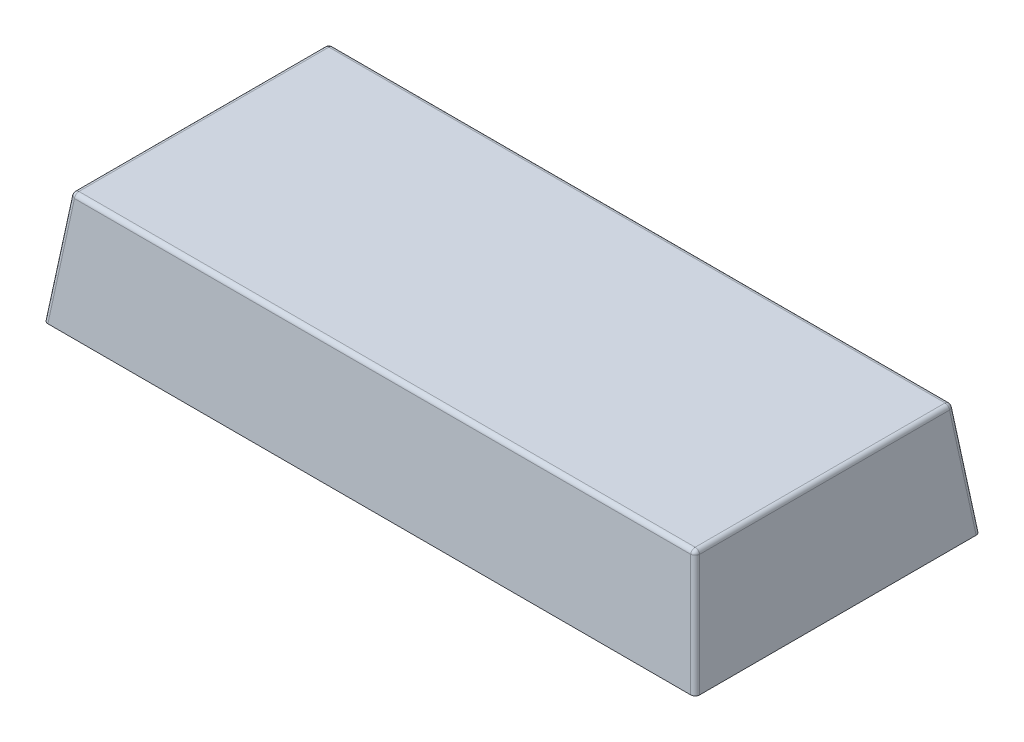
ISO-10303-21;
HEADER;
FILE_DESCRIPTION(('STEP AP214'),'2;1');
FILE_NAME('part.step','',(''),(''),'','','');
FILE_SCHEMA(('AUTOMOTIVE_DESIGN { 1 0 10303 214 1 1 1 1 }'));
ENDSEC;
DATA;
#1=APPLICATION_CONTEXT('core data for automotive mechanical design processes');
#2=APPLICATION_PROTOCOL_DEFINITION('international standard','automotive_design',2000,#1);
#3=PRODUCT_CONTEXT('',#1,'mechanical');
#4=PRODUCT('Part','Part','',(#3));
#5=PRODUCT_RELATED_PRODUCT_CATEGORY('part','',(#4));
#6=PRODUCT_DEFINITION_FORMATION('','',#4);
#7=PRODUCT_DEFINITION_CONTEXT('part definition',#1,'design');
#8=PRODUCT_DEFINITION('design','',#6,#7);
#9=PRODUCT_DEFINITION_SHAPE('','',#8);
#10=(LENGTH_UNIT() NAMED_UNIT(*) SI_UNIT(.MILLI.,.METRE.));
#11=(NAMED_UNIT(*) PLANE_ANGLE_UNIT() SI_UNIT($,.RADIAN.));
#12=(NAMED_UNIT(*) SI_UNIT($,.STERADIAN.) SOLID_ANGLE_UNIT());
#13=UNCERTAINTY_MEASURE_WITH_UNIT(LENGTH_MEASURE(1.E-05),#10,'distance_accuracy_value','');
#14=(GEOMETRIC_REPRESENTATION_CONTEXT(3) GLOBAL_UNCERTAINTY_ASSIGNED_CONTEXT((#13)) GLOBAL_UNIT_ASSIGNED_CONTEXT((#10,
#11,#12)) REPRESENTATION_CONTEXT('',''));
#15=CARTESIAN_POINT('',(0.,0.,0.));
#16=DIRECTION('',(0.,0.,1.));
#17=DIRECTION('',(1.,0.,0.));
#18=AXIS2_PLACEMENT_3D('',#15,#16,#17);
#19=CARTESIAN_POINT('',(2.82091321425743,0.48,0.));
#20=DIRECTION('',(0.,0.,1.));
#21=DIRECTION('',(1.,0.,0.));
#22=AXIS2_PLACEMENT_3D('',#19,#20,#21);
#23=CYLINDRICAL_SURFACE('',#22,0.02);
#24=CARTESIAN_POINT('',(2.82091321425743,0.48,-0.0790867857425713));
#25=DIRECTION('',(0.,0.,-1.));
#26=DIRECTION('',(1.,0.,0.));
#27=AXIS2_PLACEMENT_3D('',#24,#25,#26);
#28=CIRCLE('',#27,0.02);
#29=CARTESIAN_POINT('',(2.82091321425743,0.5,-0.0790867857425713));
#30=VERTEX_POINT('',#29);
#31=CARTESIAN_POINT('',(2.84076413729026,0.482437386868103,-0.0790867857425713));
#32=VERTEX_POINT('',#31);
#33=EDGE_CURVE('E27',#30,#32,#28,.T.);
#34=ORIENTED_EDGE('',*,*,#33,.T.);
#35=DIRECTION('',(0.,0.,1.));
#36=VECTOR('',#35,1.);
#37=CARTESIAN_POINT('',(2.84076413729026,0.482437386868103,0.));
#38=LINE('',#37,#36);
#39=CARTESIAN_POINT('',(2.84076413729026,0.482437386868103,-1.19091321425743));
#40=VERTEX_POINT('',#39);
#41=EDGE_CURVE('E194',#40,#32,#38,.T.);
#42=ORIENTED_EDGE('',*,*,#41,.F.);
#43=CARTESIAN_POINT('',(2.82091321425743,0.48,-1.19091321425743));
#44=DIRECTION('',(0.,0.,1.));
#45=DIRECTION('',(-1.,0.,0.));
#46=AXIS2_PLACEMENT_3D('',#43,#44,#45);
#47=CIRCLE('',#46,0.02);
#48=CARTESIAN_POINT('',(2.82091321425743,0.5,-1.19091321425743));
#49=VERTEX_POINT('',#48);
#50=EDGE_CURVE('E11',#40,#49,#47,.T.);
#51=ORIENTED_EDGE('',*,*,#50,.T.);
#52=DIRECTION('',(0.,0.,-1.));
#53=VECTOR('',#52,1.);
#54=CARTESIAN_POINT('',(2.82091321425743,0.5,0.));
#55=LINE('',#54,#53);
#56=EDGE_CURVE('E161',#30,#49,#55,.T.);
#57=ORIENTED_EDGE('',*,*,#56,.F.);
#58=EDGE_LOOP('',(#34,#42,#51,#57));
#59=FACE_BOUND('',#58,.T.);
#60=ADVANCED_FACE('F16',(#59),#23,.T.);
#61=CARTESIAN_POINT('',(2.82091321425743,0.48,-1.19091321425743));
#62=DIRECTION('',(0.,1.,0.));
#63=DIRECTION('',(1.,0.,0.));
#64=AXIS2_PLACEMENT_3D('',#61,#62,#63);
#65=SPHERICAL_SURFACE('',#64,0.02);
#66=CARTESIAN_POINT('',(2.82091321425743,0.48,-1.19091321425743));
#67=DIRECTION('',(-0.120974291151355,0.985256536015293,0.120974291151352));
#68=DIRECTION('',(-0.992546151641322,-0.121869343405148,0.));
#69=AXIS2_PLACEMENT_3D('',#66,#67,#68);
#70=CIRCLE('',#69,0.02);
#71=CARTESIAN_POINT('',(2.82091321425743,0.482437386868103,-1.21076413729026));
#72=VERTEX_POINT('',#71);
#73=EDGE_CURVE('E203',#40,#72,#70,.T.);
#74=ORIENTED_EDGE('',*,*,#73,.T.);
#75=CARTESIAN_POINT('',(2.82091321425743,0.48,-1.19091321425743));
#76=DIRECTION('',(1.,0.,0.));
#77=DIRECTION('',(0.,1.,0.));
#78=AXIS2_PLACEMENT_3D('',#75,#76,#77);
#79=CIRCLE('',#78,0.02);
#80=EDGE_CURVE('E20',#72,#49,#79,.T.);
#81=ORIENTED_EDGE('',*,*,#80,.T.);
#82=ORIENTED_EDGE('',*,*,#50,.F.);
#83=EDGE_LOOP('',(#74,#81,#82));
#84=FACE_BOUND('',#83,.T.);
#85=ADVANCED_FACE('F18',(#84),#65,.T.);
#86=CARTESIAN_POINT('',(2.82091321425743,0.48,-0.0790867857425713));
#87=DIRECTION('',(0.,1.,0.));
#88=DIRECTION('',(1.,0.,0.));
#89=AXIS2_PLACEMENT_3D('',#86,#87,#88);
#90=SPHERICAL_SURFACE('',#89,0.02);
#91=CARTESIAN_POINT('',(2.82091321425743,0.48,-0.0790867857425713));
#92=DIRECTION('',(1.,0.,0.));
#93=DIRECTION('',(0.,0.,-1.));
#94=AXIS2_PLACEMENT_3D('',#91,#92,#93);
#95=CIRCLE('',#94,0.02);
#96=CARTESIAN_POINT('',(2.82091321425743,0.482437386868103,-0.0592358627097449));
#97=VERTEX_POINT('',#96);
#98=EDGE_CURVE('E212',#30,#97,#95,.T.);
#99=ORIENTED_EDGE('',*,*,#98,.T.);
#100=CARTESIAN_POINT('',(2.82091321425743,0.48,-0.0790867857425713));
#101=DIRECTION('',(-0.120974291151356,0.985256536015293,-0.120974291151356));
#102=DIRECTION('',(0.,0.121869343405149,0.992546151641322));
#103=AXIS2_PLACEMENT_3D('',#100,#101,#102);
#104=CIRCLE('',#103,0.02);
#105=EDGE_CURVE('E133',#97,#32,#104,.T.);
#106=ORIENTED_EDGE('',*,*,#105,.T.);
#107=ORIENTED_EDGE('',*,*,#33,.F.);
#108=EDGE_LOOP('',(#99,#106,#107));
#109=FACE_BOUND('',#108,.T.);
#110=ADVANCED_FACE('F322',(#109),#90,.T.);
#111=CARTESIAN_POINT('',(2.83799873139432,0.34084962953608,-1.20799873139432));
#112=DIRECTION('',(0.120974291151355,-0.985256536015293,-0.120974291151355));
#113=DIRECTION('',(0.,0.121869343405148,-0.992546151641322));
#114=AXIS2_PLACEMENT_3D('',#111,#112,#113);
#115=CYLINDRICAL_SURFACE('',#114,0.02);
#116=CARTESIAN_POINT('',(2.87984980349082,0.,-1.24984980349082));
#117=DIRECTION('',(0.,-1.,0.));
#118=DIRECTION('',(0.707106781186543,0.,-0.707106781186552));
#119=AXIS2_PLACEMENT_3D('',#116,#117,#118);
#120=ELLIPSE('',#119,0.0202992817290883,0.02);
#121=CARTESIAN_POINT('',(2.88014907696717,0.,-1.27));
#122=VERTEX_POINT('',#121);
#123=CARTESIAN_POINT('',(2.9,0.,-1.25014907696717));
#124=VERTEX_POINT('',#123);
#125=EDGE_CURVE('E47',#122,#124,#120,.T.);
#126=ORIENTED_EDGE('',*,*,#125,.F.);
#127=DIRECTION('',(0.120974291151355,-0.985256536015293,-0.120974291151355));
#128=VECTOR('',#127,1.);
#129=CARTESIAN_POINT('',(2.83799873139432,0.343287016404183,-1.22784965442714));
#130=LINE('',#129,#128);
#131=EDGE_CURVE('E174',#72,#122,#130,.T.);
#132=ORIENTED_EDGE('',*,*,#131,.F.);
#133=ORIENTED_EDGE('',*,*,#73,.F.);
#134=DIRECTION('',(-0.120974291151355,0.985256536015293,0.120974291151355));
#135=VECTOR('',#134,1.);
#136=CARTESIAN_POINT('',(2.88170434439205,0.14900615739808,-1.23185342135922));
#137=LINE('',#136,#135);
#138=EDGE_CURVE('E217',#124,#40,#137,.T.);
#139=ORIENTED_EDGE('',*,*,#138,.F.);
#140=EDGE_LOOP('',(#126,#132,#133,#139));
#141=FACE_BOUND('',#140,.T.);
#142=ADVANCED_FACE('F266',(#141),#115,.T.);
#143=CARTESIAN_POINT('',(0.,0.48,-1.19091321425743));
#144=DIRECTION('',(1.,0.,0.));
#145=DIRECTION('',(0.,0.,-1.));
#146=AXIS2_PLACEMENT_3D('',#143,#144,#145);
#147=CYLINDRICAL_SURFACE('',#146,0.02);
#148=CARTESIAN_POINT('',(0.0790867857425713,0.48,-1.19091321425743));
#149=DIRECTION('',(1.,0.,0.));
#150=DIRECTION('',(0.,0.,1.));
#151=AXIS2_PLACEMENT_3D('',#148,#149,#150);
#152=CIRCLE('',#151,0.02);
#153=CARTESIAN_POINT('',(0.0790867857425713,0.482437386868103,-1.21076413729026));
#154=VERTEX_POINT('',#153);
#155=CARTESIAN_POINT('',(0.0790867857425713,0.5,-1.19091321425743));
#156=VERTEX_POINT('',#155);
#157=EDGE_CURVE('E125',#154,#156,#152,.T.);
#158=ORIENTED_EDGE('',*,*,#157,.T.);
#159=DIRECTION('',(-1.,0.,0.));
#160=VECTOR('',#159,1.);
#161=CARTESIAN_POINT('',(0.,0.5,-1.19091321425743));
#162=LINE('',#161,#160);
#163=EDGE_CURVE('E126',#49,#156,#162,.T.);
#164=ORIENTED_EDGE('',*,*,#163,.F.);
#165=ORIENTED_EDGE('',*,*,#80,.F.);
#166=DIRECTION('',(1.,0.,0.));
#167=VECTOR('',#166,1.);
#168=CARTESIAN_POINT('',(0.,0.482437386868103,-1.21076413729026));
#169=LINE('',#168,#167);
#170=EDGE_CURVE('E129',#154,#72,#169,.T.);
#171=ORIENTED_EDGE('',*,*,#170,.F.);
#172=EDGE_LOOP('',(#158,#164,#165,#171));
#173=FACE_BOUND('',#172,.T.);
#174=ADVANCED_FACE('F123',(#173),#147,.T.);
#175=CARTESIAN_POINT('',(0.,0.48,-0.0790867857425713));
#176=DIRECTION('',(-1.,0.,0.));
#177=DIRECTION('',(0.,0.,1.));
#178=AXIS2_PLACEMENT_3D('',#175,#176,#177);
#179=CYLINDRICAL_SURFACE('',#178,0.02);
#180=CARTESIAN_POINT('',(0.0790867857425713,0.48,-0.0790867857425713));
#181=DIRECTION('',(1.,0.,0.));
#182=DIRECTION('',(0.,0.,1.));
#183=AXIS2_PLACEMENT_3D('',#180,#181,#182);
#184=CIRCLE('',#183,0.02);
#185=CARTESIAN_POINT('',(0.0790867857425713,0.5,-0.0790867857425713));
#186=VERTEX_POINT('',#185);
#187=CARTESIAN_POINT('',(0.0790867857425713,0.482437386868103,-0.0592358627097449));
#188=VERTEX_POINT('',#187);
#189=EDGE_CURVE('E134',#186,#188,#184,.T.);
#190=ORIENTED_EDGE('',*,*,#189,.T.);
#191=DIRECTION('',(-1.,0.,0.));
#192=VECTOR('',#191,1.);
#193=CARTESIAN_POINT('',(0.,0.482437386868103,-0.0592358627097449));
#194=LINE('',#193,#192);
#195=EDGE_CURVE('E202',#97,#188,#194,.T.);
#196=ORIENTED_EDGE('',*,*,#195,.F.);
#197=ORIENTED_EDGE('',*,*,#98,.F.);
#198=DIRECTION('',(1.,0.,0.));
#199=VECTOR('',#198,1.);
#200=CARTESIAN_POINT('',(0.,0.5,-0.0790867857425713));
#201=LINE('',#200,#199);
#202=EDGE_CURVE('E169',#186,#30,#201,.T.);
#203=ORIENTED_EDGE('',*,*,#202,.F.);
#204=EDGE_LOOP('',(#190,#196,#197,#203));
#205=FACE_BOUND('',#204,.T.);
#206=ADVANCED_FACE('F288',(#205),#179,.T.);
#207=CARTESIAN_POINT('',(2.88043959084108,-0.00480343249931864,-0.0195604091589214));
#208=DIRECTION('',(0.120974291151355,-0.985256536015293,0.120974291151355));
#209=DIRECTION('',(0.,-0.121869343405148,-0.992546151641322));
#210=AXIS2_PLACEMENT_3D('',#207,#208,#209);
#211=CYLINDRICAL_SURFACE('',#210,0.02);
#212=CARTESIAN_POINT('',(2.87984980349082,0.,-0.020150196509177));
#213=DIRECTION('',(0.,-1.,0.));
#214=DIRECTION('',(-0.707106781186548,0.,-0.707106781186547));
#215=AXIS2_PLACEMENT_3D('',#212,#213,#214);
#216=ELLIPSE('',#215,0.0202992817290882,0.02);
#217=CARTESIAN_POINT('',(2.9,0.,-0.0198509230328264));
#218=VERTEX_POINT('',#217);
#219=CARTESIAN_POINT('',(2.88014907696717,0.,0.));
#220=VERTEX_POINT('',#219);
#221=EDGE_CURVE('E239',#218,#220,#216,.T.);
#222=ORIENTED_EDGE('',*,*,#221,.F.);
#223=DIRECTION('',(0.120974291151355,-0.985256536015293,0.120974291151355));
#224=VECTOR('',#223,1.);
#225=CARTESIAN_POINT('',(2.90029051387391,-0.00236604563121569,-0.0195604091589214));
#226=LINE('',#225,#224);
#227=EDGE_CURVE('E173',#32,#218,#226,.T.);
#228=ORIENTED_EDGE('',*,*,#227,.F.);
#229=ORIENTED_EDGE('',*,*,#105,.F.);
#230=DIRECTION('',(-0.120974291151355,0.985256536015293,-0.120974291151355));
#231=VECTOR('',#230,1.);
#232=CARTESIAN_POINT('',(2.83799873139432,0.343287016404183,-0.042150345572856));
#233=LINE('',#232,#231);
#234=EDGE_CURVE('E196',#220,#97,#233,.T.);
#235=ORIENTED_EDGE('',*,*,#234,.F.);
#236=EDGE_LOOP('',(#222,#228,#229,#235));
#237=FACE_BOUND('',#236,.T.);
#238=ADVANCED_FACE('F299',(#237),#211,.T.);
#239=CARTESIAN_POINT('',(0.0790867857425713,0.48,-1.19091321425743));
#240=DIRECTION('',(0.,1.,0.));
#241=DIRECTION('',(1.,0.,0.));
#242=AXIS2_PLACEMENT_3D('',#239,#240,#241);
#243=SPHERICAL_SURFACE('',#242,0.02);
#244=CARTESIAN_POINT('',(0.0790867857425713,0.48,-1.19091321425743));
#245=DIRECTION('',(0.120974291151358,0.985256536015293,0.120974291151356));
#246=DIRECTION('',(-0.992546151641322,0.121869343405151,0.));
#247=AXIS2_PLACEMENT_3D('',#244,#245,#246);
#248=CIRCLE('',#247,0.02);
#249=CARTESIAN_POINT('',(0.0592358627097449,0.482437386868103,-1.19091321425743));
#250=VERTEX_POINT('',#249);
#251=EDGE_CURVE('E143',#154,#250,#248,.T.);
#252=ORIENTED_EDGE('',*,*,#251,.T.);
#253=CARTESIAN_POINT('',(0.0790867857425713,0.48,-1.19091321425743));
#254=DIRECTION('',(0.,0.,-1.));
#255=DIRECTION('',(0.,1.,0.));
#256=AXIS2_PLACEMENT_3D('',#253,#254,#255);
#257=CIRCLE('',#256,0.02);
#258=EDGE_CURVE('E139',#250,#156,#257,.T.);
#259=ORIENTED_EDGE('',*,*,#258,.T.);
#260=ORIENTED_EDGE('',*,*,#157,.F.);
#261=EDGE_LOOP('',(#252,#259,#260));
#262=FACE_BOUND('',#261,.T.);
#263=ADVANCED_FACE('F138',(#262),#243,.T.);
#264=CARTESIAN_POINT('',(0.0790867857425713,0.48,-0.0790867857425713));
#265=DIRECTION('',(0.,1.,0.));
#266=DIRECTION('',(1.,0.,0.));
#267=AXIS2_PLACEMENT_3D('',#264,#265,#266);
#268=SPHERICAL_SURFACE('',#267,0.02);
#269=CARTESIAN_POINT('',(0.0790867857425713,0.48,-0.0790867857425713));
#270=DIRECTION('',(0.,0.,1.));
#271=DIRECTION('',(1.,0.,0.));
#272=AXIS2_PLACEMENT_3D('',#269,#270,#271);
#273=CIRCLE('',#272,0.02);
#274=CARTESIAN_POINT('',(0.0592358627097449,0.482437386868103,-0.0790867857425713));
#275=VERTEX_POINT('',#274);
#276=EDGE_CURVE('E148',#186,#275,#273,.T.);
#277=ORIENTED_EDGE('',*,*,#276,.T.);
#278=CARTESIAN_POINT('',(0.0790867857425713,0.48,-0.0790867857425713));
#279=DIRECTION('',(0.120974291151356,0.985256536015293,-0.120974291151356));
#280=DIRECTION('',(0.,0.121869343405149,0.992546151641322));
#281=AXIS2_PLACEMENT_3D('',#278,#279,#280);
#282=CIRCLE('',#281,0.02);
#283=EDGE_CURVE('E150',#275,#188,#282,.T.);
#284=ORIENTED_EDGE('',*,*,#283,.T.);
#285=ORIENTED_EDGE('',*,*,#189,.F.);
#286=EDGE_LOOP('',(#277,#284,#285));
#287=FACE_BOUND('',#286,.T.);
#288=ADVANCED_FACE('F308',(#287),#268,.T.);
#289=CARTESIAN_POINT('',(0.0381465786407788,0.146568770529977,-1.23185342135922));
#290=DIRECTION('',(-0.120974291151355,-0.985256536015293,-0.120974291151355));
#291=DIRECTION('',(0.,0.121869343405148,-0.992546151641322));
#292=AXIS2_PLACEMENT_3D('',#289,#290,#291);
#293=CYLINDRICAL_SURFACE('',#292,0.02);
#294=CARTESIAN_POINT('',(0.020150196509177,0.,-1.24984980349082));
#295=DIRECTION('',(0.,-1.,0.));
#296=DIRECTION('',(-0.707106781186548,0.,-0.707106781186547));
#297=AXIS2_PLACEMENT_3D('',#294,#295,#296);
#298=ELLIPSE('',#297,0.0202992817290882,0.02);
#299=CARTESIAN_POINT('',(0.,0.,-1.25014907696717));
#300=VERTEX_POINT('',#299);
#301=CARTESIAN_POINT('',(0.0198509230328264,0.,-1.27));
#302=VERTEX_POINT('',#301);
#303=EDGE_CURVE('E39',#300,#302,#298,.T.);
#304=ORIENTED_EDGE('',*,*,#303,.F.);
#305=DIRECTION('',(-0.120974291151355,-0.985256536015293,-0.120974291151355));
#306=VECTOR('',#305,1.);
#307=CARTESIAN_POINT('',(0.0182956556079524,0.14900615739808,-1.23185342135922));
#308=LINE('',#307,#306);
#309=EDGE_CURVE('E178',#250,#300,#308,.T.);
#310=ORIENTED_EDGE('',*,*,#309,.F.);
#311=ORIENTED_EDGE('',*,*,#251,.F.);
#312=DIRECTION('',(0.120974291151355,0.985256536015293,0.120974291151355));
#313=VECTOR('',#312,1.);
#314=CARTESIAN_POINT('',(0.0195604091589214,-0.00236604563121568,-1.27029051387391));
#315=LINE('',#314,#313);
#316=EDGE_CURVE('E233',#302,#154,#315,.T.);
#317=ORIENTED_EDGE('',*,*,#316,.F.);
#318=EDGE_LOOP('',(#304,#310,#311,#317));
#319=FACE_BOUND('',#318,.T.);
#320=ADVANCED_FACE('F271',(#319),#293,.T.);
#321=CARTESIAN_POINT('',(0.0790867857425713,0.48,0.));
#322=DIRECTION('',(0.,0.,-1.));
#323=DIRECTION('',(-1.,0.,0.));
#324=AXIS2_PLACEMENT_3D('',#321,#322,#323);
#325=CYLINDRICAL_SURFACE('',#324,0.02);
#326=ORIENTED_EDGE('',*,*,#258,.F.);
#327=DIRECTION('',(0.,0.,-1.));
#328=VECTOR('',#327,1.);
#329=CARTESIAN_POINT('',(0.0592358627097449,0.482437386868103,0.));
#330=LINE('',#329,#328);
#331=EDGE_CURVE('E160',#275,#250,#330,.T.);
#332=ORIENTED_EDGE('',*,*,#331,.F.);
#333=ORIENTED_EDGE('',*,*,#276,.F.);
#334=DIRECTION('',(0.,0.,1.));
#335=VECTOR('',#334,1.);
#336=CARTESIAN_POINT('',(0.0790867857425713,0.5,0.));
#337=LINE('',#336,#335);
#338=EDGE_CURVE('E151',#156,#186,#337,.T.);
#339=ORIENTED_EDGE('',*,*,#338,.F.);
#340=EDGE_LOOP('',(#326,#332,#333,#339));
#341=FACE_BOUND('',#340,.T.);
#342=ADVANCED_FACE('F155',(#341),#325,.T.);
#343=CARTESIAN_POINT('',(0.0195604091589214,-0.00480343249931864,-0.0195604091589214));
#344=DIRECTION('',(-0.120974291151355,-0.985256536015293,0.120974291151355));
#345=DIRECTION('',(0.,-0.121869343405148,-0.992546151641322));
#346=AXIS2_PLACEMENT_3D('',#343,#344,#345);
#347=CYLINDRICAL_SURFACE('',#346,0.02);
#348=CARTESIAN_POINT('',(0.020150196509177,0.,-0.020150196509177));
#349=DIRECTION('',(0.,-1.,0.));
#350=DIRECTION('',(0.707106781186548,0.,-0.707106781186547));
#351=AXIS2_PLACEMENT_3D('',#348,#349,#350);
#352=ELLIPSE('',#351,0.0202992817290882,0.02);
#353=CARTESIAN_POINT('',(0.0198509230328264,0.,0.));
#354=VERTEX_POINT('',#353);
#355=CARTESIAN_POINT('',(0.,0.,-0.0198509230328265));
#356=VERTEX_POINT('',#355);
#357=EDGE_CURVE('E242',#354,#356,#352,.T.);
#358=ORIENTED_EDGE('',*,*,#357,.F.);
#359=DIRECTION('',(-0.120974291151355,-0.985256536015293,0.120974291151355));
#360=VECTOR('',#359,1.);
#361=CARTESIAN_POINT('',(0.0195604091589214,-0.00236604563121569,0.000290513873905054));
#362=LINE('',#361,#360);
#363=EDGE_CURVE('E206',#188,#354,#362,.T.);
#364=ORIENTED_EDGE('',*,*,#363,.F.);
#365=ORIENTED_EDGE('',*,*,#283,.F.);
#366=DIRECTION('',(0.120974291151355,0.985256536015293,-0.120974291151355));
#367=VECTOR('',#366,1.);
#368=CARTESIAN_POINT('',(-0.000290513873905055,-0.00236604563121569,-0.0195604091589214));
#369=LINE('',#368,#367);
#370=EDGE_CURVE('E188',#356,#275,#369,.T.);
#371=ORIENTED_EDGE('',*,*,#370,.F.);
#372=EDGE_LOOP('',(#358,#364,#365,#371));
#373=FACE_BOUND('',#372,.T.);
#374=ADVANCED_FACE('F301',(#373),#347,.T.);
#375=CARTESIAN_POINT('',(0.,0.,0.));
#376=DIRECTION('',(0.,-1.,0.));
#377=DIRECTION('',(0.,0.,-1.));
#378=AXIS2_PLACEMENT_3D('',#375,#376,#377);
#379=PLANE('',#378);
#380=DIRECTION('',(-1.,0.,0.));
#381=VECTOR('',#380,1.);
#382=CARTESIAN_POINT('',(0.,0.,-1.27));
#383=LINE('',#382,#381);
#384=EDGE_CURVE('E229',#122,#302,#383,.T.);
#385=ORIENTED_EDGE('',*,*,#384,.F.);
#386=ORIENTED_EDGE('',*,*,#125,.T.);
#387=DIRECTION('',(0.,0.,-1.));
#388=VECTOR('',#387,1.);
#389=CARTESIAN_POINT('',(2.9,0.,0.));
#390=LINE('',#389,#388);
#391=EDGE_CURVE('E207',#218,#124,#390,.T.);
#392=ORIENTED_EDGE('',*,*,#391,.F.);
#393=ORIENTED_EDGE('',*,*,#221,.T.);
#394=DIRECTION('',(1.,0.,0.));
#395=VECTOR('',#394,1.);
#396=CARTESIAN_POINT('',(0.,0.,0.));
#397=LINE('',#396,#395);
#398=EDGE_CURVE('E191',#354,#220,#397,.T.);
#399=ORIENTED_EDGE('',*,*,#398,.F.);
#400=ORIENTED_EDGE('',*,*,#357,.T.);
#401=DIRECTION('',(0.,0.,1.));
#402=VECTOR('',#401,1.);
#403=CARTESIAN_POINT('',(0.,0.,0.));
#404=LINE('',#403,#402);
#405=EDGE_CURVE('E183',#300,#356,#404,.T.);
#406=ORIENTED_EDGE('',*,*,#405,.F.);
#407=ORIENTED_EDGE('',*,*,#303,.T.);
#408=EDGE_LOOP('',(#385,#386,#392,#393,#399,#400,#406,#407));
#409=FACE_BOUND('',#408,.T.);
#410=ADVANCED_FACE('F296',(#409),#379,.T.);
#411=CARTESIAN_POINT('',(0.,0.,-1.27));
#412=DIRECTION('',(0.,0.121869343405148,-0.992546151641322));
#413=DIRECTION('',(-1.,0.,0.));
#414=AXIS2_PLACEMENT_3D('',#411,#412,#413);
#415=PLANE('',#414);
#416=ORIENTED_EDGE('',*,*,#170,.T.);
#417=ORIENTED_EDGE('',*,*,#131,.T.);
#418=ORIENTED_EDGE('',*,*,#384,.T.);
#419=ORIENTED_EDGE('',*,*,#316,.T.);
#420=EDGE_LOOP('',(#416,#417,#418,#419));
#421=FACE_BOUND('',#420,.T.);
#422=ADVANCED_FACE('F267',(#421),#415,.T.);
#423=CARTESIAN_POINT('',(2.9,0.,0.));
#424=DIRECTION('',(0.992546151641322,0.121869343405148,0.));
#425=DIRECTION('',(0.,0.,-1.));
#426=AXIS2_PLACEMENT_3D('',#423,#424,#425);
#427=PLANE('',#426);
#428=ORIENTED_EDGE('',*,*,#391,.T.);
#429=ORIENTED_EDGE('',*,*,#138,.T.);
#430=ORIENTED_EDGE('',*,*,#41,.T.);
#431=ORIENTED_EDGE('',*,*,#227,.T.);
#432=EDGE_LOOP('',(#428,#429,#430,#431));
#433=FACE_BOUND('',#432,.T.);
#434=ADVANCED_FACE('F293',(#433),#427,.T.);
#435=CARTESIAN_POINT('',(0.,0.,0.));
#436=DIRECTION('',(0.,0.121869343405148,0.992546151641322));
#437=DIRECTION('',(1.,0.,0.));
#438=AXIS2_PLACEMENT_3D('',#435,#436,#437);
#439=PLANE('',#438);
#440=ORIENTED_EDGE('',*,*,#398,.T.);
#441=ORIENTED_EDGE('',*,*,#234,.T.);
#442=ORIENTED_EDGE('',*,*,#195,.T.);
#443=ORIENTED_EDGE('',*,*,#363,.T.);
#444=EDGE_LOOP('',(#440,#441,#442,#443));
#445=FACE_BOUND('',#444,.T.);
#446=ADVANCED_FACE('F305',(#445),#439,.T.);
#447=CARTESIAN_POINT('',(0.,0.,0.));
#448=DIRECTION('',(-0.992546151641322,0.121869343405148,0.));
#449=DIRECTION('',(0.,0.,1.));
#450=AXIS2_PLACEMENT_3D('',#447,#448,#449);
#451=PLANE('',#450);
#452=ORIENTED_EDGE('',*,*,#331,.T.);
#453=ORIENTED_EDGE('',*,*,#309,.T.);
#454=ORIENTED_EDGE('',*,*,#405,.T.);
#455=ORIENTED_EDGE('',*,*,#370,.T.);
#456=EDGE_LOOP('',(#452,#453,#454,#455));
#457=FACE_BOUND('',#456,.T.);
#458=ADVANCED_FACE('F273',(#457),#451,.T.);
#459=CARTESIAN_POINT('',(0.,0.5,0.));
#460=DIRECTION('',(0.,-1.,0.));
#461=DIRECTION('',(0.,0.,-1.));
#462=AXIS2_PLACEMENT_3D('',#459,#460,#461);
#463=PLANE('',#462);
#464=ORIENTED_EDGE('',*,*,#202,.T.);
#465=ORIENTED_EDGE('',*,*,#56,.T.);
#466=ORIENTED_EDGE('',*,*,#163,.T.);
#467=ORIENTED_EDGE('',*,*,#338,.T.);
#468=EDGE_LOOP('',(#464,#465,#466,#467));
#469=FACE_BOUND('',#468,.T.);
#470=ADVANCED_FACE('F157',(#469),#463,.F.);
#471=CLOSED_SHELL('',(#60,#85,#110,#142,#174,#206,#238,#263,#288,#320,#342,#374,#410,#422,#434,
#446,#458,#470));
#472=MANIFOLD_SOLID_BREP('B1',#471);
#473=ADVANCED_BREP_SHAPE_REPRESENTATION('',(#18,#472),#14);
#474=SHAPE_DEFINITION_REPRESENTATION(#9,#473);
ENDSEC;
END-ISO-10303-21;
